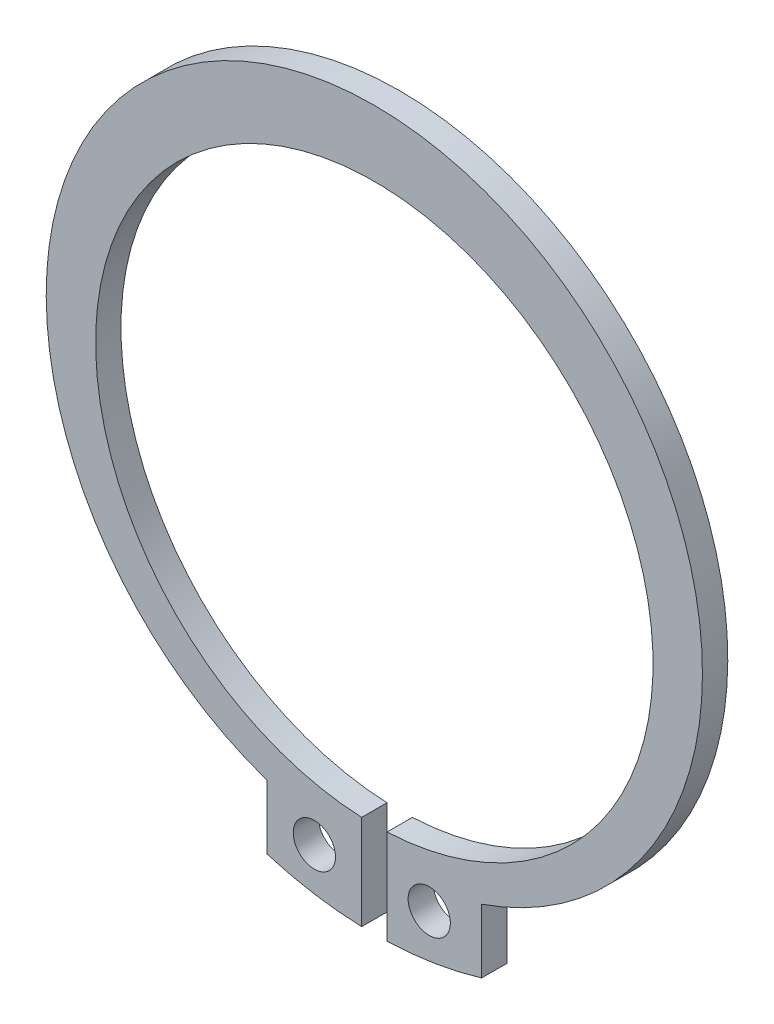
ISO-10303-21;
HEADER;
FILE_DESCRIPTION(('STEP AP214'),'2;1');
FILE_NAME('part.step','',(''),(''),'','','');
FILE_SCHEMA(('AUTOMOTIVE_DESIGN { 1 0 10303 214 1 1 1 1 }'));
ENDSEC;
DATA;
#1=APPLICATION_CONTEXT('core data for automotive mechanical design processes');
#2=APPLICATION_PROTOCOL_DEFINITION('international standard','automotive_design',2000,#1);
#3=PRODUCT_CONTEXT('',#1,'mechanical');
#4=PRODUCT('Part','Part','',(#3));
#5=PRODUCT_RELATED_PRODUCT_CATEGORY('part','',(#4));
#6=PRODUCT_DEFINITION_FORMATION('','',#4);
#7=PRODUCT_DEFINITION_CONTEXT('part definition',#1,'design');
#8=PRODUCT_DEFINITION('design','',#6,#7);
#9=PRODUCT_DEFINITION_SHAPE('','',#8);
#10=(LENGTH_UNIT() NAMED_UNIT(*) SI_UNIT(.MILLI.,.METRE.));
#11=(NAMED_UNIT(*) PLANE_ANGLE_UNIT() SI_UNIT($,.RADIAN.));
#12=(NAMED_UNIT(*) SI_UNIT($,.STERADIAN.) SOLID_ANGLE_UNIT());
#13=UNCERTAINTY_MEASURE_WITH_UNIT(LENGTH_MEASURE(1.E-05),#10,'distance_accuracy_value','');
#14=(GEOMETRIC_REPRESENTATION_CONTEXT(3) GLOBAL_UNCERTAINTY_ASSIGNED_CONTEXT((#13)) GLOBAL_UNIT_ASSIGNED_CONTEXT((#10,
#11,#12)) REPRESENTATION_CONTEXT('',''));
#15=CARTESIAN_POINT('',(0.,0.,0.));
#16=DIRECTION('',(0.,0.,1.));
#17=DIRECTION('',(1.,0.,0.));
#18=AXIS2_PLACEMENT_3D('',#15,#16,#17);
#19=CARTESIAN_POINT('',(-0.559954751131228,-16.4904957680685,1.5));
#20=DIRECTION('',(-1.,0.,0.));
#21=DIRECTION('',(0.,0.,1.));
#22=AXIS2_PLACEMENT_3D('',#19,#20,#21);
#23=PLANE('',#22);
#24=DIRECTION('',(0.,1.,0.));
#25=VECTOR('',#24,1.);
#26=CARTESIAN_POINT('',(-0.559954751131228,-16.4904957680685,0.));
#27=LINE('',#26,#25);
#28=CARTESIAN_POINT('',(-0.559954751131242,-16.4904957680685,0.));
#29=VERTEX_POINT('',#28);
#30=CARTESIAN_POINT('',(-0.559954751131207,-10.8861714105931,0.));
#31=VERTEX_POINT('',#30);
#32=EDGE_CURVE('E98',#29,#31,#27,.T.);
#33=ORIENTED_EDGE('',*,*,#32,.T.);
#34=DIRECTION('',(0.,0.,-1.));
#35=VECTOR('',#34,1.);
#36=CARTESIAN_POINT('',(-0.559954751131207,-10.8861714105931,1.5));
#37=LINE('',#36,#35);
#38=CARTESIAN_POINT('',(-0.559954751131207,-10.8861714105931,1.5));
#39=VERTEX_POINT('',#38);
#40=EDGE_CURVE('E11',#39,#31,#37,.T.);
#41=ORIENTED_EDGE('',*,*,#40,.F.);
#42=DIRECTION('',(0.,1.,0.));
#43=VECTOR('',#42,1.);
#44=CARTESIAN_POINT('',(-0.559954751131228,-16.4904957680685,1.5));
#45=LINE('',#44,#43);
#46=CARTESIAN_POINT('',(-0.559954751131242,-16.4904957680685,1.5));
#47=VERTEX_POINT('',#46);
#48=EDGE_CURVE('E118',#47,#39,#45,.T.);
#49=ORIENTED_EDGE('',*,*,#48,.F.);
#50=DIRECTION('',(0.,0.,-1.));
#51=VECTOR('',#50,1.);
#52=CARTESIAN_POINT('',(-0.559954751131242,-16.4904957680685,1.5));
#53=LINE('',#52,#51);
#54=EDGE_CURVE('E133',#47,#29,#53,.T.);
#55=ORIENTED_EDGE('',*,*,#54,.T.);
#56=EDGE_LOOP('',(#33,#41,#49,#55));
#57=FACE_BOUND('',#56,.T.);
#58=ADVANCED_FACE('F17',(#57),#23,.F.);
#59=CARTESIAN_POINT('',(0.190045248868773,5.59677432128386,1.5));
#60=DIRECTION('',(0.,0.,-1.));
#61=DIRECTION('',(-1.,0.,0.));
#62=AXIS2_PLACEMENT_3D('',#59,#60,#61);
#63=CYLINDRICAL_SURFACE('',#62,16.5);
#64=CARTESIAN_POINT('',(0.190045248868773,5.59677432128386,0.));
#65=DIRECTION('',(0.,0.,1.));
#66=DIRECTION('',(1.,0.,0.));
#67=AXIS2_PLACEMENT_3D('',#64,#65,#66);
#68=CIRCLE('',#67,16.5);
#69=CARTESIAN_POINT('',(0.94004524886878,-10.8861714105931,0.));
#70=VERTEX_POINT('',#69);
#71=EDGE_CURVE('E92',#70,#31,#68,.T.);
#72=ORIENTED_EDGE('',*,*,#71,.F.);
#73=DIRECTION('',(0.,0.,-1.));
#74=VECTOR('',#73,1.);
#75=CARTESIAN_POINT('',(0.94004524886878,-10.8861714105931,1.5));
#76=LINE('',#75,#74);
#77=CARTESIAN_POINT('',(0.94004524886878,-10.8861714105931,1.5));
#78=VERTEX_POINT('',#77);
#79=EDGE_CURVE('E20',#78,#70,#76,.T.);
#80=ORIENTED_EDGE('',*,*,#79,.F.);
#81=CARTESIAN_POINT('',(0.190045248868773,5.59677432128386,1.5));
#82=DIRECTION('',(0.,0.,1.));
#83=DIRECTION('',(1.,0.,0.));
#84=AXIS2_PLACEMENT_3D('',#81,#82,#83);
#85=CIRCLE('',#84,16.5);
#86=EDGE_CURVE('E121',#78,#39,#85,.T.);
#87=ORIENTED_EDGE('',*,*,#86,.T.);
#88=ORIENTED_EDGE('',*,*,#40,.T.);
#89=EDGE_LOOP('',(#72,#80,#87,#88));
#90=FACE_BOUND('',#89,.T.);
#91=ADVANCED_FACE('F93',(#90),#63,.F.);
#92=CARTESIAN_POINT('',(0.94004524886878,-16.4904957680685,1.5));
#93=DIRECTION('',(-1.,0.,0.));
#94=DIRECTION('',(0.,-1.,0.));
#95=AXIS2_PLACEMENT_3D('',#92,#93,#94);
#96=PLANE('',#95);
#97=DIRECTION('',(0.,1.,0.));
#98=VECTOR('',#97,1.);
#99=CARTESIAN_POINT('',(0.94004524886878,-16.4904957680685,0.));
#100=LINE('',#99,#98);
#101=CARTESIAN_POINT('',(0.94004524886878,-16.4904957680685,0.));
#102=VERTEX_POINT('',#101);
#103=EDGE_CURVE('E84',#102,#70,#100,.T.);
#104=ORIENTED_EDGE('',*,*,#103,.F.);
#105=DIRECTION('',(0.,0.,-1.));
#106=VECTOR('',#105,1.);
#107=CARTESIAN_POINT('',(0.94004524886878,-16.4904957680685,1.5));
#108=LINE('',#107,#106);
#109=CARTESIAN_POINT('',(0.94004524886878,-16.4904957680685,1.5));
#110=VERTEX_POINT('',#109);
#111=EDGE_CURVE('E90',#110,#102,#108,.T.);
#112=ORIENTED_EDGE('',*,*,#111,.F.);
#113=DIRECTION('',(0.,1.,0.));
#114=VECTOR('',#113,1.);
#115=CARTESIAN_POINT('',(0.94004524886878,-16.4904957680685,1.5));
#116=LINE('',#115,#114);
#117=EDGE_CURVE('E86',#110,#78,#116,.T.);
#118=ORIENTED_EDGE('',*,*,#117,.T.);
#119=ORIENTED_EDGE('',*,*,#79,.T.);
#120=EDGE_LOOP('',(#104,#112,#118,#119));
#121=FACE_BOUND('',#120,.T.);
#122=ADVANCED_FACE('F82',(#121),#96,.T.);
#123=CARTESIAN_POINT('',(0.190045248868773,5.59677432128386,1.5));
#124=DIRECTION('',(0.,0.,-1.));
#125=DIRECTION('',(-1.,0.,0.));
#126=AXIS2_PLACEMENT_3D('',#123,#124,#125);
#127=CYLINDRICAL_SURFACE('',#126,22.1);
#128=CARTESIAN_POINT('',(0.190045248868773,5.59677432128386,0.));
#129=DIRECTION('',(0.,0.,1.));
#130=DIRECTION('',(1.,0.,0.));
#131=AXIS2_PLACEMENT_3D('',#128,#129,#130);
#132=CIRCLE('',#131,22.1);
#133=CARTESIAN_POINT('',(6.54004524886877,-15.5713030595271,0.));
#134=VERTEX_POINT('',#133);
#135=EDGE_CURVE('E103',#102,#134,#132,.T.);
#136=ORIENTED_EDGE('',*,*,#135,.T.);
#137=DIRECTION('',(0.,0.,-1.));
#138=VECTOR('',#137,1.);
#139=CARTESIAN_POINT('',(6.54004524886877,-15.5713030595271,1.5));
#140=LINE('',#139,#138);
#141=CARTESIAN_POINT('',(6.54004524886877,-15.5713030595271,1.5));
#142=VERTEX_POINT('',#141);
#143=EDGE_CURVE('E143',#142,#134,#140,.T.);
#144=ORIENTED_EDGE('',*,*,#143,.F.);
#145=CARTESIAN_POINT('',(0.190045248868773,5.59677432128386,1.5));
#146=DIRECTION('',(0.,0.,1.));
#147=DIRECTION('',(1.,0.,0.));
#148=AXIS2_PLACEMENT_3D('',#145,#146,#147);
#149=CIRCLE('',#148,22.1);
#150=EDGE_CURVE('E124',#110,#142,#149,.T.);
#151=ORIENTED_EDGE('',*,*,#150,.F.);
#152=ORIENTED_EDGE('',*,*,#111,.T.);
#153=EDGE_LOOP('',(#136,#144,#151,#152));
#154=FACE_BOUND('',#153,.T.);
#155=ADVANCED_FACE('F148',(#154),#127,.T.);
#156=CARTESIAN_POINT('',(6.54004524886878,-15.5713030595271,1.5));
#157=DIRECTION('',(-1.,0.,0.));
#158=DIRECTION('',(0.,0.,1.));
#159=AXIS2_PLACEMENT_3D('',#156,#157,#158);
#160=PLANE('',#159);
#161=DIRECTION('',(0.,1.,0.));
#162=VECTOR('',#161,1.);
#163=CARTESIAN_POINT('',(6.54004524886878,-15.5713030595271,0.));
#164=LINE('',#163,#162);
#165=CARTESIAN_POINT('',(6.54004524886878,-11.7860067265443,0.));
#166=VERTEX_POINT('',#165);
#167=EDGE_CURVE('E105',#134,#166,#164,.T.);
#168=ORIENTED_EDGE('',*,*,#167,.T.);
#169=DIRECTION('',(0.,0.,-1.));
#170=VECTOR('',#169,1.);
#171=CARTESIAN_POINT('',(6.54004524886878,-11.7860067265443,1.5));
#172=LINE('',#171,#170);
#173=CARTESIAN_POINT('',(6.54004524886878,-11.7860067265443,1.5));
#174=VERTEX_POINT('',#173);
#175=EDGE_CURVE('E140',#174,#166,#172,.T.);
#176=ORIENTED_EDGE('',*,*,#175,.F.);
#177=DIRECTION('',(0.,1.,0.));
#178=VECTOR('',#177,1.);
#179=CARTESIAN_POINT('',(6.54004524886878,-15.5713030595271,1.5));
#180=LINE('',#179,#178);
#181=EDGE_CURVE('E126',#142,#174,#180,.T.);
#182=ORIENTED_EDGE('',*,*,#181,.F.);
#183=ORIENTED_EDGE('',*,*,#143,.T.);
#184=EDGE_LOOP('',(#168,#176,#182,#183));
#185=FACE_BOUND('',#184,.T.);
#186=ADVANCED_FACE('F164',(#185),#160,.F.);
#187=CARTESIAN_POINT('',(0.190045248868773,6.57177432128387,1.5));
#188=DIRECTION('',(0.,0.,-1.));
#189=DIRECTION('',(-1.,0.,0.));
#190=AXIS2_PLACEMENT_3D('',#187,#188,#189);
#191=CYLINDRICAL_SURFACE('',#190,19.425);
#192=CARTESIAN_POINT('',(0.190045248868773,6.57177432128387,0.));
#193=DIRECTION('',(0.,0.,1.));
#194=DIRECTION('',(1.,0.,0.));
#195=AXIS2_PLACEMENT_3D('',#192,#193,#194);
#196=CIRCLE('',#195,19.425);
#197=CARTESIAN_POINT('',(-6.15995475113123,-11.7860067265443,0.));
#198=VERTEX_POINT('',#197);
#199=EDGE_CURVE('E110',#166,#198,#196,.T.);
#200=ORIENTED_EDGE('',*,*,#199,.T.);
#201=DIRECTION('',(0.,0.,-1.));
#202=VECTOR('',#201,1.);
#203=CARTESIAN_POINT('',(-6.15995475113123,-11.7860067265443,1.5));
#204=LINE('',#203,#202);
#205=CARTESIAN_POINT('',(-6.15995475113123,-11.7860067265443,1.5));
#206=VERTEX_POINT('',#205);
#207=EDGE_CURVE('E138',#206,#198,#204,.T.);
#208=ORIENTED_EDGE('',*,*,#207,.F.);
#209=CARTESIAN_POINT('',(0.190045248868773,6.57177432128387,1.5));
#210=DIRECTION('',(0.,0.,1.));
#211=DIRECTION('',(1.,0.,0.));
#212=AXIS2_PLACEMENT_3D('',#209,#210,#211);
#213=CIRCLE('',#212,19.425);
#214=EDGE_CURVE('E128',#174,#206,#213,.T.);
#215=ORIENTED_EDGE('',*,*,#214,.F.);
#216=ORIENTED_EDGE('',*,*,#175,.T.);
#217=EDGE_LOOP('',(#200,#208,#215,#216));
#218=FACE_BOUND('',#217,.T.);
#219=ADVANCED_FACE('F161',(#218),#191,.T.);
#220=CARTESIAN_POINT('',(-6.15995475113123,-15.5713030595271,1.5));
#221=DIRECTION('',(-1.,0.,0.));
#222=DIRECTION('',(0.,0.,1.));
#223=AXIS2_PLACEMENT_3D('',#220,#221,#222);
#224=PLANE('',#223);
#225=DIRECTION('',(0.,1.,0.));
#226=VECTOR('',#225,1.);
#227=CARTESIAN_POINT('',(-6.15995475113123,-15.5713030595271,0.));
#228=LINE('',#227,#226);
#229=CARTESIAN_POINT('',(-6.15995475113123,-15.5713030595271,0.));
#230=VERTEX_POINT('',#229);
#231=EDGE_CURVE('E113',#230,#198,#228,.T.);
#232=ORIENTED_EDGE('',*,*,#231,.F.);
#233=DIRECTION('',(0.,0.,-1.));
#234=VECTOR('',#233,1.);
#235=CARTESIAN_POINT('',(-6.15995475113123,-15.5713030595271,1.5));
#236=LINE('',#235,#234);
#237=CARTESIAN_POINT('',(-6.15995475113123,-15.5713030595271,1.5));
#238=VERTEX_POINT('',#237);
#239=EDGE_CURVE('E39',#238,#230,#236,.T.);
#240=ORIENTED_EDGE('',*,*,#239,.F.);
#241=DIRECTION('',(0.,1.,0.));
#242=VECTOR('',#241,1.);
#243=CARTESIAN_POINT('',(-6.15995475113123,-15.5713030595271,1.5));
#244=LINE('',#243,#242);
#245=EDGE_CURVE('E130',#238,#206,#244,.T.);
#246=ORIENTED_EDGE('',*,*,#245,.T.);
#247=ORIENTED_EDGE('',*,*,#207,.T.);
#248=EDGE_LOOP('',(#232,#240,#246,#247));
#249=FACE_BOUND('',#248,.T.);
#250=ADVANCED_FACE('F157',(#249),#224,.T.);
#251=CARTESIAN_POINT('',(0.190045248868773,5.59677432128386,1.5));
#252=DIRECTION('',(0.,0.,-1.));
#253=DIRECTION('',(-1.,0.,0.));
#254=AXIS2_PLACEMENT_3D('',#251,#252,#253);
#255=CYLINDRICAL_SURFACE('',#254,22.1);
#256=CARTESIAN_POINT('',(0.190045248868773,5.59677432128386,0.));
#257=DIRECTION('',(0.,0.,1.));
#258=DIRECTION('',(1.,0.,0.));
#259=AXIS2_PLACEMENT_3D('',#256,#257,#258);
#260=CIRCLE('',#259,22.1);
#261=EDGE_CURVE('E116',#230,#29,#260,.T.);
#262=ORIENTED_EDGE('',*,*,#261,.T.);
#263=ORIENTED_EDGE('',*,*,#54,.F.);
#264=CARTESIAN_POINT('',(0.190045248868773,5.59677432128386,1.5));
#265=DIRECTION('',(0.,0.,1.));
#266=DIRECTION('',(1.,0.,0.));
#267=AXIS2_PLACEMENT_3D('',#264,#265,#266);
#268=CIRCLE('',#267,22.1);
#269=EDGE_CURVE('E31',#238,#47,#268,.T.);
#270=ORIENTED_EDGE('',*,*,#269,.F.);
#271=ORIENTED_EDGE('',*,*,#239,.T.);
#272=EDGE_LOOP('',(#262,#263,#270,#271));
#273=FACE_BOUND('',#272,.T.);
#274=ADVANCED_FACE('F212',(#273),#255,.T.);
#275=CARTESIAN_POINT('',(0.190045248868773,5.59677432128386,1.5));
#276=DIRECTION('',(0.,0.,1.));
#277=DIRECTION('',(1.,0.,0.));
#278=AXIS2_PLACEMENT_3D('',#275,#276,#277);
#279=PLANE('',#278);
#280=CARTESIAN_POINT('',(3.44004524886878,-13.6904957680685,1.5));
#281=DIRECTION('',(0.,0.,-1.));
#282=DIRECTION('',(0.,1.,0.));
#283=AXIS2_PLACEMENT_3D('',#280,#281,#282);
#284=CIRCLE('',#283,1.25);
#285=CARTESIAN_POINT('',(3.44004524886878,-12.4404957680685,1.5));
#286=VERTEX_POINT('',#285);
#287=EDGE_CURVE('E267',#286,#286,#284,.T.);
#288=ORIENTED_EDGE('',*,*,#287,.T.);
#289=EDGE_LOOP('',(#288));
#290=FACE_BOUND('',#289,.T.);
#291=CARTESIAN_POINT('',(-3.35995475113122,-13.6904957680685,1.5));
#292=DIRECTION('',(0.,0.,-1.));
#293=DIRECTION('',(0.,1.,0.));
#294=AXIS2_PLACEMENT_3D('',#291,#292,#293);
#295=CIRCLE('',#294,1.25);
#296=CARTESIAN_POINT('',(-3.35995475113122,-12.4404957680685,1.5));
#297=VERTEX_POINT('',#296);
#298=EDGE_CURVE('E120',#297,#297,#295,.T.);
#299=ORIENTED_EDGE('',*,*,#298,.T.);
#300=EDGE_LOOP('',(#299));
#301=FACE_BOUND('',#300,.T.);
#302=ORIENTED_EDGE('',*,*,#48,.T.);
#303=ORIENTED_EDGE('',*,*,#86,.F.);
#304=ORIENTED_EDGE('',*,*,#117,.F.);
#305=ORIENTED_EDGE('',*,*,#150,.T.);
#306=ORIENTED_EDGE('',*,*,#181,.T.);
#307=ORIENTED_EDGE('',*,*,#214,.T.);
#308=ORIENTED_EDGE('',*,*,#245,.F.);
#309=ORIENTED_EDGE('',*,*,#269,.T.);
#310=EDGE_LOOP('',(#302,#303,#304,#305,#306,#307,#308,#309));
#311=FACE_BOUND('',#310,.T.);
#312=ADVANCED_FACE('F151',(#290,#301,#311),#279,.T.);
#313=CARTESIAN_POINT('',(0.190045248868773,5.59677432128386,0.));
#314=DIRECTION('',(0.,0.,1.));
#315=DIRECTION('',(1.,0.,0.));
#316=AXIS2_PLACEMENT_3D('',#313,#314,#315);
#317=PLANE('',#316);
#318=CARTESIAN_POINT('',(3.44004524886878,-13.6904957680685,0.));
#319=DIRECTION('',(0.,0.,1.));
#320=DIRECTION('',(0.,1.,0.));
#321=AXIS2_PLACEMENT_3D('',#318,#319,#320);
#322=CIRCLE('',#321,1.25);
#323=CARTESIAN_POINT('',(3.44004524886878,-12.4404957680685,0.));
#324=VERTEX_POINT('',#323);
#325=EDGE_CURVE('E270',#324,#324,#322,.T.);
#326=ORIENTED_EDGE('',*,*,#325,.T.);
#327=EDGE_LOOP('',(#326));
#328=FACE_BOUND('',#327,.T.);
#329=CARTESIAN_POINT('',(-3.35995475113122,-13.6904957680685,0.));
#330=DIRECTION('',(0.,0.,1.));
#331=DIRECTION('',(0.,1.,0.));
#332=AXIS2_PLACEMENT_3D('',#329,#330,#331);
#333=CIRCLE('',#332,1.25);
#334=CARTESIAN_POINT('',(-3.35995475113122,-12.4404957680685,0.));
#335=VERTEX_POINT('',#334);
#336=EDGE_CURVE('E272',#335,#335,#333,.T.);
#337=ORIENTED_EDGE('',*,*,#336,.T.);
#338=EDGE_LOOP('',(#337));
#339=FACE_BOUND('',#338,.T.);
#340=ORIENTED_EDGE('',*,*,#32,.F.);
#341=ORIENTED_EDGE('',*,*,#261,.F.);
#342=ORIENTED_EDGE('',*,*,#231,.T.);
#343=ORIENTED_EDGE('',*,*,#199,.F.);
#344=ORIENTED_EDGE('',*,*,#167,.F.);
#345=ORIENTED_EDGE('',*,*,#135,.F.);
#346=ORIENTED_EDGE('',*,*,#103,.T.);
#347=ORIENTED_EDGE('',*,*,#71,.T.);
#348=EDGE_LOOP('',(#340,#341,#342,#343,#344,#345,#346,#347));
#349=FACE_BOUND('',#348,.T.);
#350=ADVANCED_FACE('F101',(#328,#339,#349),#317,.F.);
#351=CARTESIAN_POINT('',(-3.35995475113122,-13.6904957680685,0.));
#352=DIRECTION('',(0.,0.,1.));
#353=DIRECTION('',(0.,1.,0.));
#354=AXIS2_PLACEMENT_3D('',#351,#352,#353);
#355=CYLINDRICAL_SURFACE('',#354,1.25);
#356=ORIENTED_EDGE('',*,*,#298,.F.);
#357=EDGE_LOOP('',(#356));
#358=FACE_BOUND('',#357,.T.);
#359=ORIENTED_EDGE('',*,*,#336,.F.);
#360=EDGE_LOOP('',(#359));
#361=FACE_BOUND('',#360,.T.);
#362=ADVANCED_FACE('F238',(#358,#361),#355,.F.);
#363=CARTESIAN_POINT('',(3.44004524886878,-13.6904957680685,0.));
#364=DIRECTION('',(0.,0.,1.));
#365=DIRECTION('',(0.,1.,0.));
#366=AXIS2_PLACEMENT_3D('',#363,#364,#365);
#367=CYLINDRICAL_SURFACE('',#366,1.25);
#368=ORIENTED_EDGE('',*,*,#287,.F.);
#369=EDGE_LOOP('',(#368));
#370=FACE_BOUND('',#369,.T.);
#371=ORIENTED_EDGE('',*,*,#325,.F.);
#372=EDGE_LOOP('',(#371));
#373=FACE_BOUND('',#372,.T.);
#374=ADVANCED_FACE('F248',(#370,#373),#367,.F.);
#375=CLOSED_SHELL('',(#58,#91,#122,#155,#186,#219,#250,#274,#312,#350,#362,#374));
#376=MANIFOLD_SOLID_BREP('B1',#375);
#377=ADVANCED_BREP_SHAPE_REPRESENTATION('',(#18,#376),#14);
#378=SHAPE_DEFINITION_REPRESENTATION(#9,#377);
ENDSEC;
END-ISO-10303-21;
